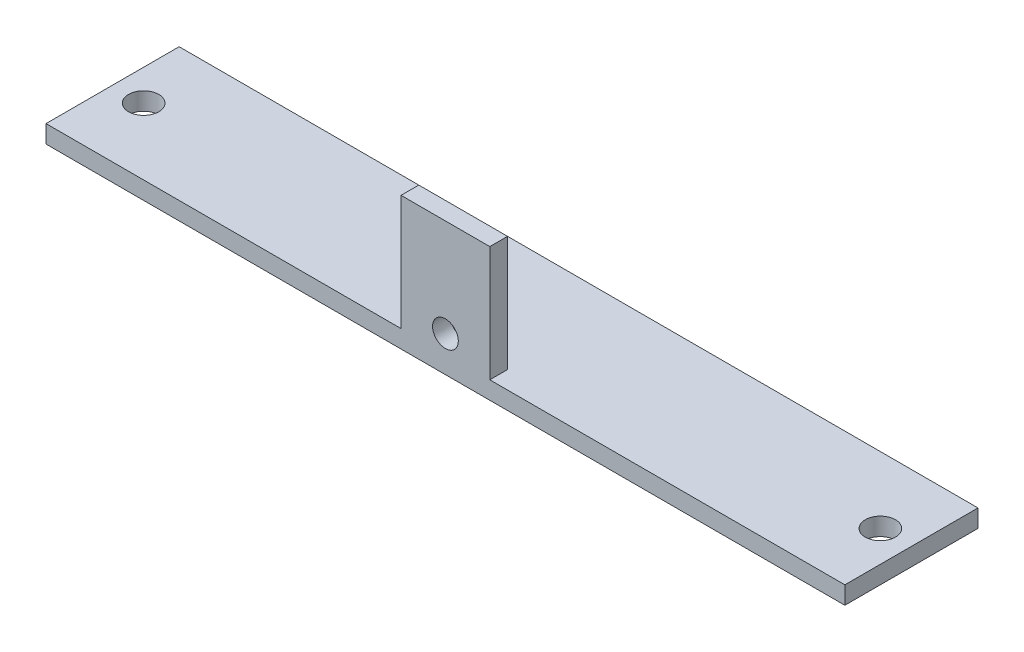
ISO-10303-21;
HEADER;
FILE_DESCRIPTION(('STEP AP214'),'2;1');
FILE_NAME('part.step','',(''),(''),'','','');
FILE_SCHEMA(('AUTOMOTIVE_DESIGN { 1 0 10303 214 1 1 1 1 }'));
ENDSEC;
DATA;
#1=APPLICATION_CONTEXT('core data for automotive mechanical design processes');
#2=APPLICATION_PROTOCOL_DEFINITION('international standard','automotive_design',2000,#1);
#3=PRODUCT_CONTEXT('',#1,'mechanical');
#4=PRODUCT('Part','Part','',(#3));
#5=PRODUCT_RELATED_PRODUCT_CATEGORY('part','',(#4));
#6=PRODUCT_DEFINITION_FORMATION('','',#4);
#7=PRODUCT_DEFINITION_CONTEXT('part definition',#1,'design');
#8=PRODUCT_DEFINITION('design','',#6,#7);
#9=PRODUCT_DEFINITION_SHAPE('','',#8);
#10=(LENGTH_UNIT() NAMED_UNIT(*) SI_UNIT(.MILLI.,.METRE.));
#11=(NAMED_UNIT(*) PLANE_ANGLE_UNIT() SI_UNIT($,.RADIAN.));
#12=(NAMED_UNIT(*) SI_UNIT($,.STERADIAN.) SOLID_ANGLE_UNIT());
#13=UNCERTAINTY_MEASURE_WITH_UNIT(LENGTH_MEASURE(1.E-05),#10,'distance_accuracy_value','');
#14=(GEOMETRIC_REPRESENTATION_CONTEXT(3) GLOBAL_UNCERTAINTY_ASSIGNED_CONTEXT((#13)) GLOBAL_UNIT_ASSIGNED_CONTEXT((#10,
#11,#12)) REPRESENTATION_CONTEXT('',''));
#15=CARTESIAN_POINT('',(0.,0.,0.));
#16=DIRECTION('',(0.,0.,1.));
#17=DIRECTION('',(1.,0.,0.));
#18=AXIS2_PLACEMENT_3D('',#15,#16,#17);
#19=CARTESIAN_POINT('',(45.,15.,7.5));
#20=DIRECTION('',(-1.,0.,0.));
#21=DIRECTION('',(0.,0.,1.));
#22=AXIS2_PLACEMENT_3D('',#19,#20,#21);
#23=PLANE('',#22);
#24=DIRECTION('',(0.,0.,1.));
#25=VECTOR('',#24,1.);
#26=CARTESIAN_POINT('',(45.,2.,-7.5));
#27=LINE('',#26,#25);
#28=CARTESIAN_POINT('',(45.,2.,-7.5));
#29=VERTEX_POINT('',#28);
#30=CARTESIAN_POINT('',(45.,2.,7.5));
#31=VERTEX_POINT('',#30);
#32=EDGE_CURVE('E101',#29,#31,#27,.T.);
#33=ORIENTED_EDGE('',*,*,#32,.T.);
#34=DIRECTION('',(0.,-1.,0.));
#35=VECTOR('',#34,1.);
#36=CARTESIAN_POINT('',(45.,15.,7.5));
#37=LINE('',#36,#35);
#38=CARTESIAN_POINT('',(45.,0.,7.5));
#39=VERTEX_POINT('',#38);
#40=EDGE_CURVE('E59',#31,#39,#37,.T.);
#41=ORIENTED_EDGE('',*,*,#40,.T.);
#42=DIRECTION('',(0.,0.,-1.));
#43=VECTOR('',#42,1.);
#44=CARTESIAN_POINT('',(45.,0.,7.5));
#45=LINE('',#44,#43);
#46=CARTESIAN_POINT('',(45.,0.,-7.5));
#47=VERTEX_POINT('',#46);
#48=EDGE_CURVE('E155',#39,#47,#45,.T.);
#49=ORIENTED_EDGE('',*,*,#48,.T.);
#50=DIRECTION('',(0.,-1.,0.));
#51=VECTOR('',#50,1.);
#52=CARTESIAN_POINT('',(45.,15.,-7.5));
#53=LINE('',#52,#51);
#54=EDGE_CURVE('E11',#29,#47,#53,.T.);
#55=ORIENTED_EDGE('',*,*,#54,.F.);
#56=EDGE_LOOP('',(#33,#41,#49,#55));
#57=FACE_BOUND('',#56,.T.);
#58=ADVANCED_FACE('F35',(#57),#23,.F.);
#59=CARTESIAN_POINT('',(-45.,15.,-7.5));
#60=DIRECTION('',(0.,0.,1.));
#61=DIRECTION('',(1.,0.,0.));
#62=AXIS2_PLACEMENT_3D('',#59,#60,#61);
#63=PLANE('',#62);
#64=DIRECTION('',(0.,-1.,0.));
#65=VECTOR('',#64,1.);
#66=CARTESIAN_POINT('',(-45.,15.,-7.5));
#67=LINE('',#66,#65);
#68=CARTESIAN_POINT('',(-45.,2.,-7.5));
#69=VERTEX_POINT('',#68);
#70=CARTESIAN_POINT('',(-45.,0.,-7.5));
#71=VERTEX_POINT('',#70);
#72=EDGE_CURVE('E43',#69,#71,#67,.T.);
#73=ORIENTED_EDGE('',*,*,#72,.F.);
#74=DIRECTION('',(-1.,0.,0.));
#75=VECTOR('',#74,1.);
#76=CARTESIAN_POINT('',(45.,2.,-7.5));
#77=LINE('',#76,#75);
#78=EDGE_CURVE('E105',#29,#69,#77,.T.);
#79=ORIENTED_EDGE('',*,*,#78,.F.);
#80=ORIENTED_EDGE('',*,*,#54,.T.);
#81=DIRECTION('',(-1.,0.,0.));
#82=VECTOR('',#81,1.);
#83=CARTESIAN_POINT('',(-45.,0.,-7.5));
#84=LINE('',#83,#82);
#85=EDGE_CURVE('E159',#47,#71,#84,.T.);
#86=ORIENTED_EDGE('',*,*,#85,.T.);
#87=EDGE_LOOP('',(#73,#79,#80,#86));
#88=FACE_BOUND('',#87,.T.);
#89=ADVANCED_FACE('F173',(#88),#63,.F.);
#90=CARTESIAN_POINT('',(-45.,15.,7.5));
#91=DIRECTION('',(1.,0.,0.));
#92=DIRECTION('',(0.,0.,-1.));
#93=AXIS2_PLACEMENT_3D('',#90,#91,#92);
#94=PLANE('',#93);
#95=DIRECTION('',(0.,-1.,0.));
#96=VECTOR('',#95,1.);
#97=CARTESIAN_POINT('',(-45.,15.,7.5));
#98=LINE('',#97,#96);
#99=CARTESIAN_POINT('',(-45.,2.,7.5));
#100=VERTEX_POINT('',#99);
#101=CARTESIAN_POINT('',(-45.,0.,7.5));
#102=VERTEX_POINT('',#101);
#103=EDGE_CURVE('E122',#100,#102,#98,.T.);
#104=ORIENTED_EDGE('',*,*,#103,.F.);
#105=DIRECTION('',(0.,0.,1.));
#106=VECTOR('',#105,1.);
#107=CARTESIAN_POINT('',(-45.,2.,-7.5));
#108=LINE('',#107,#106);
#109=EDGE_CURVE('E106',#69,#100,#108,.T.);
#110=ORIENTED_EDGE('',*,*,#109,.F.);
#111=ORIENTED_EDGE('',*,*,#72,.T.);
#112=DIRECTION('',(0.,0.,1.));
#113=VECTOR('',#112,1.);
#114=CARTESIAN_POINT('',(-45.,0.,7.5));
#115=LINE('',#114,#113);
#116=EDGE_CURVE('E161',#71,#102,#115,.T.);
#117=ORIENTED_EDGE('',*,*,#116,.T.);
#118=EDGE_LOOP('',(#104,#110,#111,#117));
#119=FACE_BOUND('',#118,.T.);
#120=ADVANCED_FACE('F166',(#119),#94,.F.);
#121=CARTESIAN_POINT('',(-45.,15.,7.5));
#122=DIRECTION('',(0.,0.,-1.));
#123=DIRECTION('',(-1.,0.,0.));
#124=AXIS2_PLACEMENT_3D('',#121,#122,#123);
#125=PLANE('',#124);
#126=CARTESIAN_POINT('',(0.,4.,7.5));
#127=DIRECTION('',(0.,0.,-1.));
#128=DIRECTION('',(-1.,0.,0.));
#129=AXIS2_PLACEMENT_3D('',#126,#127,#128);
#130=CIRCLE('',#129,1.45);
#131=CARTESIAN_POINT('',(-1.45,4.,7.5));
#132=VERTEX_POINT('',#131);
#133=EDGE_CURVE('E38',#132,#132,#130,.T.);
#134=ORIENTED_EDGE('',*,*,#133,.T.);
#135=EDGE_LOOP('',(#134));
#136=FACE_BOUND('',#135,.T.);
#137=DIRECTION('',(-1.,0.,0.));
#138=VECTOR('',#137,1.);
#139=CARTESIAN_POINT('',(45.,2.,7.5));
#140=LINE('',#139,#138);
#141=CARTESIAN_POINT('',(5.,2.,7.5));
#142=VERTEX_POINT('',#141);
#143=EDGE_CURVE('E109',#31,#142,#140,.T.);
#144=ORIENTED_EDGE('',*,*,#143,.T.);
#145=DIRECTION('',(0.,1.,0.));
#146=VECTOR('',#145,1.);
#147=CARTESIAN_POINT('',(5.00000000000001,15.,7.5));
#148=LINE('',#147,#146);
#149=CARTESIAN_POINT('',(5.00000000000001,15.,7.5));
#150=VERTEX_POINT('',#149);
#151=EDGE_CURVE('E115',#142,#150,#148,.T.);
#152=ORIENTED_EDGE('',*,*,#151,.T.);
#153=DIRECTION('',(1.,0.,0.));
#154=VECTOR('',#153,1.);
#155=CARTESIAN_POINT('',(-45.,15.,7.5));
#156=LINE('',#155,#154);
#157=CARTESIAN_POINT('',(-4.99999999999999,15.,7.5));
#158=VERTEX_POINT('',#157);
#159=EDGE_CURVE('E123',#158,#150,#156,.T.);
#160=ORIENTED_EDGE('',*,*,#159,.F.);
#161=DIRECTION('',(0.,-1.,0.));
#162=VECTOR('',#161,1.);
#163=CARTESIAN_POINT('',(-4.99999999999999,15.,7.5));
#164=LINE('',#163,#162);
#165=CARTESIAN_POINT('',(-4.99999999999999,2.,7.5));
#166=VERTEX_POINT('',#165);
#167=EDGE_CURVE('E179',#158,#166,#164,.T.);
#168=ORIENTED_EDGE('',*,*,#167,.T.);
#169=DIRECTION('',(-1.,0.,0.));
#170=VECTOR('',#169,1.);
#171=CARTESIAN_POINT('',(-45.,2.,7.5));
#172=LINE('',#171,#170);
#173=EDGE_CURVE('E176',#166,#100,#172,.T.);
#174=ORIENTED_EDGE('',*,*,#173,.T.);
#175=ORIENTED_EDGE('',*,*,#103,.T.);
#176=DIRECTION('',(1.,0.,0.));
#177=VECTOR('',#176,1.);
#178=CARTESIAN_POINT('',(-45.,0.,7.5));
#179=LINE('',#178,#177);
#180=EDGE_CURVE('E120',#102,#39,#179,.T.);
#181=ORIENTED_EDGE('',*,*,#180,.T.);
#182=ORIENTED_EDGE('',*,*,#40,.F.);
#183=EDGE_LOOP('',(#144,#152,#160,#168,#174,#175,#181,#182));
#184=FACE_BOUND('',#183,.T.);
#185=ADVANCED_FACE('F118',(#136,#184),#125,.F.);
#186=CARTESIAN_POINT('',(0.,15.,0.));
#187=DIRECTION('',(0.,-1.,0.));
#188=DIRECTION('',(0.,0.,-1.));
#189=AXIS2_PLACEMENT_3D('',#186,#187,#188);
#190=PLANE('',#189);
#191=ORIENTED_EDGE('',*,*,#159,.T.);
#192=DIRECTION('',(0.,0.,-1.));
#193=VECTOR('',#192,1.);
#194=CARTESIAN_POINT('',(5.00000000000001,15.,7.5));
#195=LINE('',#194,#193);
#196=CARTESIAN_POINT('',(5.00000000000001,15.,5.5));
#197=VERTEX_POINT('',#196);
#198=EDGE_CURVE('E186',#150,#197,#195,.T.);
#199=ORIENTED_EDGE('',*,*,#198,.T.);
#200=DIRECTION('',(-1.,0.,0.));
#201=VECTOR('',#200,1.);
#202=CARTESIAN_POINT('',(45.,15.,5.5));
#203=LINE('',#202,#201);
#204=CARTESIAN_POINT('',(-4.99999999999999,15.,5.5));
#205=VERTEX_POINT('',#204);
#206=EDGE_CURVE('E153',#197,#205,#203,.T.);
#207=ORIENTED_EDGE('',*,*,#206,.T.);
#208=DIRECTION('',(0.,0.,-1.));
#209=VECTOR('',#208,1.);
#210=CARTESIAN_POINT('',(-4.99999999999999,15.,7.5));
#211=LINE('',#210,#209);
#212=EDGE_CURVE('E146',#158,#205,#211,.T.);
#213=ORIENTED_EDGE('',*,*,#212,.F.);
#214=EDGE_LOOP('',(#191,#199,#207,#213));
#215=FACE_BOUND('',#214,.T.);
#216=ADVANCED_FACE('F224',(#215),#190,.F.);
#217=CARTESIAN_POINT('',(0.,0.,0.));
#218=DIRECTION('',(0.,-1.,0.));
#219=DIRECTION('',(0.,0.,-1.));
#220=AXIS2_PLACEMENT_3D('',#217,#218,#219);
#221=PLANE('',#220);
#222=CARTESIAN_POINT('',(-41.5,0.,0.));
#223=DIRECTION('',(0.,-1.,0.));
#224=DIRECTION('',(0.,0.,-1.));
#225=AXIS2_PLACEMENT_3D('',#222,#223,#224);
#226=CIRCLE('',#225,1.69999999999999);
#227=CARTESIAN_POINT('',(-41.5,0.,-1.69999999999999));
#228=VERTEX_POINT('',#227);
#229=EDGE_CURVE('E131',#228,#228,#226,.T.);
#230=ORIENTED_EDGE('',*,*,#229,.F.);
#231=EDGE_LOOP('',(#230));
#232=FACE_BOUND('',#231,.T.);
#233=CARTESIAN_POINT('',(41.5,0.,0.));
#234=DIRECTION('',(0.,-1.,0.));
#235=DIRECTION('',(0.,0.,-1.));
#236=AXIS2_PLACEMENT_3D('',#233,#234,#235);
#237=CIRCLE('',#236,1.69999999999999);
#238=CARTESIAN_POINT('',(41.5,0.,-1.69999999999999));
#239=VERTEX_POINT('',#238);
#240=EDGE_CURVE('E138',#239,#239,#237,.T.);
#241=ORIENTED_EDGE('',*,*,#240,.F.);
#242=EDGE_LOOP('',(#241));
#243=FACE_BOUND('',#242,.T.);
#244=ORIENTED_EDGE('',*,*,#48,.F.);
#245=ORIENTED_EDGE('',*,*,#180,.F.);
#246=ORIENTED_EDGE('',*,*,#116,.F.);
#247=ORIENTED_EDGE('',*,*,#85,.F.);
#248=EDGE_LOOP('',(#244,#245,#246,#247));
#249=FACE_BOUND('',#248,.T.);
#250=ADVANCED_FACE('F171',(#232,#243,#249),#221,.T.);
#251=CARTESIAN_POINT('',(45.,15.,5.5));
#252=DIRECTION('',(0.,0.,1.));
#253=DIRECTION('',(0.,-1.,0.));
#254=AXIS2_PLACEMENT_3D('',#251,#252,#253);
#255=PLANE('',#254);
#256=CARTESIAN_POINT('',(0.,4.,5.5));
#257=DIRECTION('',(0.,0.,-1.));
#258=DIRECTION('',(0.,1.,0.));
#259=AXIS2_PLACEMENT_3D('',#256,#257,#258);
#260=CIRCLE('',#259,1.45);
#261=CARTESIAN_POINT('',(0.,5.45,5.5));
#262=VERTEX_POINT('',#261);
#263=EDGE_CURVE('E195',#262,#262,#260,.T.);
#264=ORIENTED_EDGE('',*,*,#263,.F.);
#265=EDGE_LOOP('',(#264));
#266=FACE_BOUND('',#265,.T.);
#267=ORIENTED_EDGE('',*,*,#206,.F.);
#268=DIRECTION('',(0.,1.,0.));
#269=VECTOR('',#268,1.);
#270=CARTESIAN_POINT('',(5.00000000000001,15.,5.5));
#271=LINE('',#270,#269);
#272=CARTESIAN_POINT('',(5.,2.,5.5));
#273=VERTEX_POINT('',#272);
#274=EDGE_CURVE('E116',#273,#197,#271,.T.);
#275=ORIENTED_EDGE('',*,*,#274,.F.);
#276=DIRECTION('',(-1.,0.,0.));
#277=VECTOR('',#276,1.);
#278=CARTESIAN_POINT('',(45.,2.,5.5));
#279=LINE('',#278,#277);
#280=CARTESIAN_POINT('',(-4.99999999999998,2.,5.5));
#281=VERTEX_POINT('',#280);
#282=EDGE_CURVE('E51',#273,#281,#279,.T.);
#283=ORIENTED_EDGE('',*,*,#282,.T.);
#284=DIRECTION('',(0.,-1.,0.));
#285=VECTOR('',#284,1.);
#286=CARTESIAN_POINT('',(-4.99999999999999,15.,5.5));
#287=LINE('',#286,#285);
#288=EDGE_CURVE('E182',#205,#281,#287,.T.);
#289=ORIENTED_EDGE('',*,*,#288,.F.);
#290=EDGE_LOOP('',(#267,#275,#283,#289));
#291=FACE_BOUND('',#290,.T.);
#292=ADVANCED_FACE('F227',(#266,#291),#255,.F.);
#293=CARTESIAN_POINT('',(45.,2.,-7.5));
#294=DIRECTION('',(0.,-1.,0.));
#295=DIRECTION('',(0.,0.,-1.));
#296=AXIS2_PLACEMENT_3D('',#293,#294,#295);
#297=PLANE('',#296);
#298=CARTESIAN_POINT('',(-41.5,2.,0.));
#299=DIRECTION('',(0.,1.,0.));
#300=DIRECTION('',(0.,0.,1.));
#301=AXIS2_PLACEMENT_3D('',#298,#299,#300);
#302=CIRCLE('',#301,1.69999999999999);
#303=CARTESIAN_POINT('',(-41.5,2.,1.69999999999999));
#304=VERTEX_POINT('',#303);
#305=EDGE_CURVE('E134',#304,#304,#302,.T.);
#306=ORIENTED_EDGE('',*,*,#305,.F.);
#307=EDGE_LOOP('',(#306));
#308=FACE_BOUND('',#307,.T.);
#309=CARTESIAN_POINT('',(41.5,2.,0.));
#310=DIRECTION('',(0.,1.,0.));
#311=DIRECTION('',(0.,0.,1.));
#312=AXIS2_PLACEMENT_3D('',#309,#310,#311);
#313=CIRCLE('',#312,1.69999999999999);
#314=CARTESIAN_POINT('',(41.5,2.,1.69999999999999));
#315=VERTEX_POINT('',#314);
#316=EDGE_CURVE('E133',#315,#315,#313,.T.);
#317=ORIENTED_EDGE('',*,*,#316,.F.);
#318=EDGE_LOOP('',(#317));
#319=FACE_BOUND('',#318,.T.);
#320=ORIENTED_EDGE('',*,*,#109,.T.);
#321=ORIENTED_EDGE('',*,*,#173,.F.);
#322=DIRECTION('',(0.,0.,-1.));
#323=VECTOR('',#322,1.);
#324=CARTESIAN_POINT('',(-4.99999999999999,2.,7.5));
#325=LINE('',#324,#323);
#326=EDGE_CURVE('E141',#166,#281,#325,.T.);
#327=ORIENTED_EDGE('',*,*,#326,.T.);
#328=ORIENTED_EDGE('',*,*,#282,.F.);
#329=DIRECTION('',(0.,0.,-1.));
#330=VECTOR('',#329,1.);
#331=CARTESIAN_POINT('',(5.,2.,7.5));
#332=LINE('',#331,#330);
#333=EDGE_CURVE('E111',#142,#273,#332,.T.);
#334=ORIENTED_EDGE('',*,*,#333,.F.);
#335=ORIENTED_EDGE('',*,*,#143,.F.);
#336=ORIENTED_EDGE('',*,*,#32,.F.);
#337=ORIENTED_EDGE('',*,*,#78,.T.);
#338=EDGE_LOOP('',(#320,#321,#327,#328,#334,#335,#336,#337));
#339=FACE_BOUND('',#338,.T.);
#340=ADVANCED_FACE('F110',(#308,#319,#339),#297,.F.);
#341=CARTESIAN_POINT('',(41.5,2.,0.));
#342=DIRECTION('',(0.,1.,0.));
#343=DIRECTION('',(0.,0.,1.));
#344=AXIS2_PLACEMENT_3D('',#341,#342,#343);
#345=CYLINDRICAL_SURFACE('',#344,1.69999999999999);
#346=ORIENTED_EDGE('',*,*,#240,.T.);
#347=EDGE_LOOP('',(#346));
#348=FACE_BOUND('',#347,.T.);
#349=ORIENTED_EDGE('',*,*,#316,.T.);
#350=EDGE_LOOP('',(#349));
#351=FACE_BOUND('',#350,.T.);
#352=ADVANCED_FACE('F233',(#348,#351),#345,.F.);
#353=CARTESIAN_POINT('',(-41.5,2.,0.));
#354=DIRECTION('',(0.,1.,0.));
#355=DIRECTION('',(0.,0.,1.));
#356=AXIS2_PLACEMENT_3D('',#353,#354,#355);
#357=CYLINDRICAL_SURFACE('',#356,1.69999999999999);
#358=ORIENTED_EDGE('',*,*,#229,.T.);
#359=EDGE_LOOP('',(#358));
#360=FACE_BOUND('',#359,.T.);
#361=ORIENTED_EDGE('',*,*,#305,.T.);
#362=EDGE_LOOP('',(#361));
#363=FACE_BOUND('',#362,.T.);
#364=ADVANCED_FACE('F240',(#360,#363),#357,.F.);
#365=CARTESIAN_POINT('',(-4.99999999999999,15.,7.5));
#366=DIRECTION('',(1.,0.,0.));
#367=DIRECTION('',(0.,1.,0.));
#368=AXIS2_PLACEMENT_3D('',#365,#366,#367);
#369=PLANE('',#368);
#370=ORIENTED_EDGE('',*,*,#288,.T.);
#371=ORIENTED_EDGE('',*,*,#326,.F.);
#372=ORIENTED_EDGE('',*,*,#167,.F.);
#373=ORIENTED_EDGE('',*,*,#212,.T.);
#374=EDGE_LOOP('',(#370,#371,#372,#373));
#375=FACE_BOUND('',#374,.T.);
#376=ADVANCED_FACE('F210',(#375),#369,.F.);
#377=CARTESIAN_POINT('',(5.00000000000001,15.,7.5));
#378=DIRECTION('',(-1.,0.,0.));
#379=DIRECTION('',(0.,-1.,0.));
#380=AXIS2_PLACEMENT_3D('',#377,#378,#379);
#381=PLANE('',#380);
#382=ORIENTED_EDGE('',*,*,#274,.T.);
#383=ORIENTED_EDGE('',*,*,#198,.F.);
#384=ORIENTED_EDGE('',*,*,#151,.F.);
#385=ORIENTED_EDGE('',*,*,#333,.T.);
#386=EDGE_LOOP('',(#382,#383,#384,#385));
#387=FACE_BOUND('',#386,.T.);
#388=ADVANCED_FACE('F205',(#387),#381,.F.);
#389=CARTESIAN_POINT('',(0.,4.,5.5));
#390=DIRECTION('',(0.,0.,-1.));
#391=DIRECTION('',(0.,1.,0.));
#392=AXIS2_PLACEMENT_3D('',#389,#390,#391);
#393=CYLINDRICAL_SURFACE('',#392,1.45);
#394=ORIENTED_EDGE('',*,*,#263,.T.);
#395=EDGE_LOOP('',(#394));
#396=FACE_BOUND('',#395,.T.);
#397=ORIENTED_EDGE('',*,*,#133,.F.);
#398=EDGE_LOOP('',(#397));
#399=FACE_BOUND('',#398,.T.);
#400=ADVANCED_FACE('F203',(#396,#399),#393,.F.);
#401=CLOSED_SHELL('',(#58,#89,#120,#185,#216,#250,#292,#340,#352,#364,#376,#388,#400));
#402=MANIFOLD_SOLID_BREP('B2',#401);
#403=ADVANCED_BREP_SHAPE_REPRESENTATION('',(#18,#402),#14);
#404=SHAPE_DEFINITION_REPRESENTATION(#9,#403);
ENDSEC;
END-ISO-10303-21;
